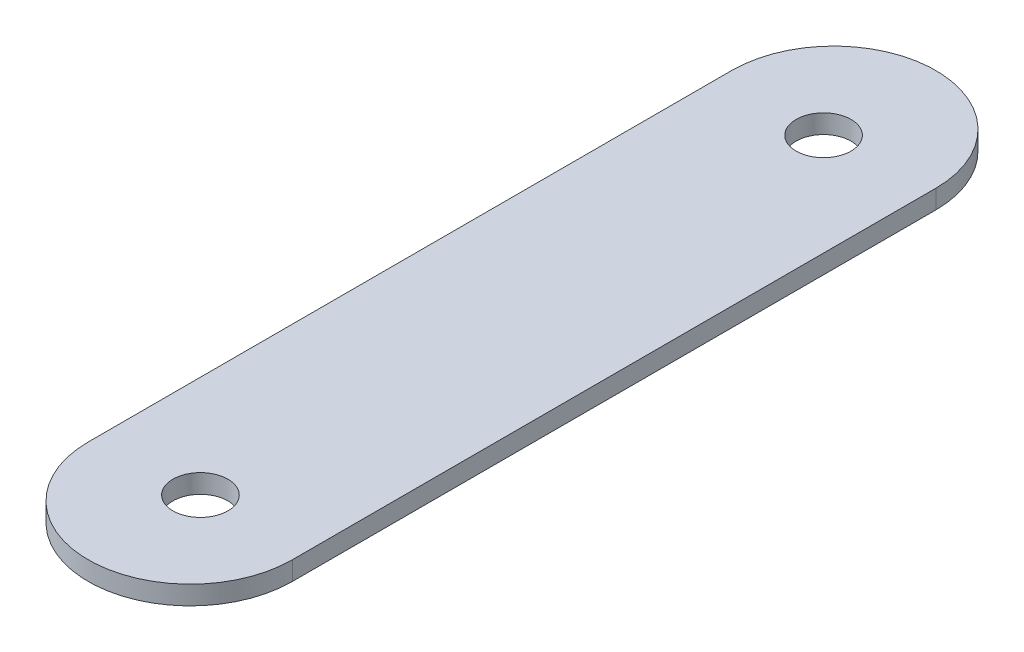
ISO-10303-21;
HEADER;
FILE_DESCRIPTION(('STEP AP214'),'2;1');
FILE_NAME('part.step','',(''),(''),'','','');
FILE_SCHEMA(('AUTOMOTIVE_DESIGN { 1 0 10303 214 1 1 1 1 }'));
ENDSEC;
DATA;
#1=APPLICATION_CONTEXT('core data for automotive mechanical design processes');
#2=APPLICATION_PROTOCOL_DEFINITION('international standard','automotive_design',2000,#1);
#3=PRODUCT_CONTEXT('',#1,'mechanical');
#4=PRODUCT('Part','Part','',(#3));
#5=PRODUCT_RELATED_PRODUCT_CATEGORY('part','',(#4));
#6=PRODUCT_DEFINITION_FORMATION('','',#4);
#7=PRODUCT_DEFINITION_CONTEXT('part definition',#1,'design');
#8=PRODUCT_DEFINITION('design','',#6,#7);
#9=PRODUCT_DEFINITION_SHAPE('','',#8);
#10=(LENGTH_UNIT() NAMED_UNIT(*) SI_UNIT(.MILLI.,.METRE.));
#11=(NAMED_UNIT(*) PLANE_ANGLE_UNIT() SI_UNIT($,.RADIAN.));
#12=(NAMED_UNIT(*) SI_UNIT($,.STERADIAN.) SOLID_ANGLE_UNIT());
#13=UNCERTAINTY_MEASURE_WITH_UNIT(LENGTH_MEASURE(1.E-05),#10,'distance_accuracy_value','');
#14=(GEOMETRIC_REPRESENTATION_CONTEXT(3) GLOBAL_UNCERTAINTY_ASSIGNED_CONTEXT((#13)) GLOBAL_UNIT_ASSIGNED_CONTEXT((#10,
#11,#12)) REPRESENTATION_CONTEXT('',''));
#15=CARTESIAN_POINT('',(0.,0.,0.));
#16=DIRECTION('',(0.,0.,1.));
#17=DIRECTION('',(1.,0.,0.));
#18=AXIS2_PLACEMENT_3D('',#15,#16,#17);
#19=CARTESIAN_POINT('',(0.,1.2,-20.5));
#20=DIRECTION('',(0.,-1.,0.));
#21=DIRECTION('',(0.,0.,-1.));
#22=AXIS2_PLACEMENT_3D('',#19,#20,#21);
#23=CYLINDRICAL_SURFACE('',#22,6.5);
#24=CARTESIAN_POINT('',(0.,0.,-20.5));
#25=DIRECTION('',(0.,-1.,0.));
#26=DIRECTION('',(0.,0.,-1.));
#27=AXIS2_PLACEMENT_3D('',#24,#25,#26);
#28=CIRCLE('',#27,6.5);
#29=CARTESIAN_POINT('',(-6.5,0.,-20.5));
#30=VERTEX_POINT('',#29);
#31=CARTESIAN_POINT('',(6.5,0.,-20.5));
#32=VERTEX_POINT('',#31);
#33=EDGE_CURVE('E104',#30,#32,#28,.T.);
#34=ORIENTED_EDGE('',*,*,#33,.F.);
#35=DIRECTION('',(0.,-1.,0.));
#36=VECTOR('',#35,1.);
#37=CARTESIAN_POINT('',(-6.5,1.2,-20.5));
#38=LINE('',#37,#36);
#39=CARTESIAN_POINT('',(-6.5,1.2,-20.5));
#40=VERTEX_POINT('',#39);
#41=EDGE_CURVE('E11',#40,#30,#38,.T.);
#42=ORIENTED_EDGE('',*,*,#41,.F.);
#43=CARTESIAN_POINT('',(0.,1.2,-20.5));
#44=DIRECTION('',(0.,-1.,0.));
#45=DIRECTION('',(0.,0.,-1.));
#46=AXIS2_PLACEMENT_3D('',#43,#44,#45);
#47=CIRCLE('',#46,6.5);
#48=CARTESIAN_POINT('',(6.5,1.2,-20.5));
#49=VERTEX_POINT('',#48);
#50=EDGE_CURVE('E97',#40,#49,#47,.T.);
#51=ORIENTED_EDGE('',*,*,#50,.T.);
#52=DIRECTION('',(0.,-1.,0.));
#53=VECTOR('',#52,1.);
#54=CARTESIAN_POINT('',(6.5,1.2,-20.5));
#55=LINE('',#54,#53);
#56=EDGE_CURVE('E42',#49,#32,#55,.T.);
#57=ORIENTED_EDGE('',*,*,#56,.T.);
#58=EDGE_LOOP('',(#34,#42,#51,#57));
#59=FACE_BOUND('',#58,.T.);
#60=ADVANCED_FACE('F39',(#59),#23,.T.);
#61=CARTESIAN_POINT('',(-6.5,1.2,20.5));
#62=DIRECTION('',(-1.,0.,0.));
#63=DIRECTION('',(0.,0.,1.));
#64=AXIS2_PLACEMENT_3D('',#61,#62,#63);
#65=PLANE('',#64);
#66=DIRECTION('',(0.,0.,-1.));
#67=VECTOR('',#66,1.);
#68=CARTESIAN_POINT('',(-6.5,0.,20.5));
#69=LINE('',#68,#67);
#70=CARTESIAN_POINT('',(-6.5,0.,20.5));
#71=VERTEX_POINT('',#70);
#72=EDGE_CURVE('E99',#71,#30,#69,.T.);
#73=ORIENTED_EDGE('',*,*,#72,.F.);
#74=DIRECTION('',(0.,-1.,0.));
#75=VECTOR('',#74,1.);
#76=CARTESIAN_POINT('',(-6.5,1.2,20.5));
#77=LINE('',#76,#75);
#78=CARTESIAN_POINT('',(-6.5,1.2,20.5));
#79=VERTEX_POINT('',#78);
#80=EDGE_CURVE('E48',#79,#71,#77,.T.);
#81=ORIENTED_EDGE('',*,*,#80,.F.);
#82=DIRECTION('',(0.,0.,-1.));
#83=VECTOR('',#82,1.);
#84=CARTESIAN_POINT('',(-6.5,1.2,20.5));
#85=LINE('',#84,#83);
#86=EDGE_CURVE('E94',#79,#40,#85,.T.);
#87=ORIENTED_EDGE('',*,*,#86,.T.);
#88=ORIENTED_EDGE('',*,*,#41,.T.);
#89=EDGE_LOOP('',(#73,#81,#87,#88));
#90=FACE_BOUND('',#89,.T.);
#91=ADVANCED_FACE('F115',(#90),#65,.T.);
#92=CARTESIAN_POINT('',(0.,1.2,20.5));
#93=DIRECTION('',(0.,-1.,0.));
#94=DIRECTION('',(0.,0.,-1.));
#95=AXIS2_PLACEMENT_3D('',#92,#93,#94);
#96=CYLINDRICAL_SURFACE('',#95,6.5);
#97=CARTESIAN_POINT('',(0.,0.,20.5));
#98=DIRECTION('',(0.,-1.,0.));
#99=DIRECTION('',(0.,0.,-1.));
#100=AXIS2_PLACEMENT_3D('',#97,#98,#99);
#101=CIRCLE('',#100,6.5);
#102=CARTESIAN_POINT('',(6.5,0.,20.5));
#103=VERTEX_POINT('',#102);
#104=EDGE_CURVE('E89',#103,#71,#101,.T.);
#105=ORIENTED_EDGE('',*,*,#104,.F.);
#106=DIRECTION('',(0.,-1.,0.));
#107=VECTOR('',#106,1.);
#108=CARTESIAN_POINT('',(6.5,1.2,20.5));
#109=LINE('',#108,#107);
#110=CARTESIAN_POINT('',(6.5,1.2,20.5));
#111=VERTEX_POINT('',#110);
#112=EDGE_CURVE('E84',#111,#103,#109,.T.);
#113=ORIENTED_EDGE('',*,*,#112,.F.);
#114=CARTESIAN_POINT('',(0.,1.2,20.5));
#115=DIRECTION('',(0.,-1.,0.));
#116=DIRECTION('',(0.,0.,-1.));
#117=AXIS2_PLACEMENT_3D('',#114,#115,#116);
#118=CIRCLE('',#117,6.5);
#119=EDGE_CURVE('E87',#111,#79,#118,.T.);
#120=ORIENTED_EDGE('',*,*,#119,.T.);
#121=ORIENTED_EDGE('',*,*,#80,.T.);
#122=EDGE_LOOP('',(#105,#113,#120,#121));
#123=FACE_BOUND('',#122,.T.);
#124=ADVANCED_FACE('F86',(#123),#96,.T.);
#125=CARTESIAN_POINT('',(6.5,1.2,-20.5));
#126=DIRECTION('',(1.,0.,0.));
#127=DIRECTION('',(0.,0.,-1.));
#128=AXIS2_PLACEMENT_3D('',#125,#126,#127);
#129=PLANE('',#128);
#130=DIRECTION('',(0.,0.,1.));
#131=VECTOR('',#130,1.);
#132=CARTESIAN_POINT('',(6.5,0.,-20.5));
#133=LINE('',#132,#131);
#134=EDGE_CURVE('E107',#32,#103,#133,.T.);
#135=ORIENTED_EDGE('',*,*,#134,.F.);
#136=ORIENTED_EDGE('',*,*,#56,.F.);
#137=DIRECTION('',(0.,0.,1.));
#138=VECTOR('',#137,1.);
#139=CARTESIAN_POINT('',(6.5,1.2,-20.5));
#140=LINE('',#139,#138);
#141=EDGE_CURVE('E93',#49,#111,#140,.T.);
#142=ORIENTED_EDGE('',*,*,#141,.T.);
#143=ORIENTED_EDGE('',*,*,#112,.T.);
#144=EDGE_LOOP('',(#135,#136,#142,#143));
#145=FACE_BOUND('',#144,.T.);
#146=ADVANCED_FACE('F96',(#145),#129,.T.);
#147=CARTESIAN_POINT('',(0.,1.2,-20.5));
#148=DIRECTION('',(0.,-1.,0.));
#149=DIRECTION('',(0.,0.,-1.));
#150=AXIS2_PLACEMENT_3D('',#147,#148,#149);
#151=PLANE('',#150);
#152=CARTESIAN_POINT('',(0.,1.2,-19.85));
#153=DIRECTION('',(0.,-1.,0.));
#154=DIRECTION('',(0.,0.,1.));
#155=AXIS2_PLACEMENT_3D('',#152,#153,#154);
#156=CIRCLE('',#155,1.75);
#157=CARTESIAN_POINT('',(0.,1.2,-18.1));
#158=VERTEX_POINT('',#157);
#159=EDGE_CURVE('E148',#158,#158,#156,.T.);
#160=ORIENTED_EDGE('',*,*,#159,.T.);
#161=EDGE_LOOP('',(#160));
#162=FACE_BOUND('',#161,.T.);
#163=CARTESIAN_POINT('',(0.,1.2,19.85));
#164=DIRECTION('',(0.,-1.,0.));
#165=DIRECTION('',(0.,0.,1.));
#166=AXIS2_PLACEMENT_3D('',#163,#164,#165);
#167=CIRCLE('',#166,1.75);
#168=CARTESIAN_POINT('',(0.,1.2,21.6));
#169=VERTEX_POINT('',#168);
#170=EDGE_CURVE('E108',#169,#169,#167,.T.);
#171=ORIENTED_EDGE('',*,*,#170,.T.);
#172=EDGE_LOOP('',(#171));
#173=FACE_BOUND('',#172,.T.);
#174=ORIENTED_EDGE('',*,*,#50,.F.);
#175=ORIENTED_EDGE('',*,*,#86,.F.);
#176=ORIENTED_EDGE('',*,*,#119,.F.);
#177=ORIENTED_EDGE('',*,*,#141,.F.);
#178=EDGE_LOOP('',(#174,#175,#176,#177));
#179=FACE_BOUND('',#178,.T.);
#180=ADVANCED_FACE('F92',(#162,#173,#179),#151,.F.);
#181=CARTESIAN_POINT('',(0.,0.,-20.5));
#182=DIRECTION('',(0.,-1.,0.));
#183=DIRECTION('',(0.,0.,-1.));
#184=AXIS2_PLACEMENT_3D('',#181,#182,#183);
#185=PLANE('',#184);
#186=CARTESIAN_POINT('',(0.,0.,-19.85));
#187=DIRECTION('',(0.,-1.,0.));
#188=DIRECTION('',(0.,0.,1.));
#189=AXIS2_PLACEMENT_3D('',#186,#187,#188);
#190=CIRCLE('',#189,1.75);
#191=CARTESIAN_POINT('',(0.,0.,-18.1));
#192=VERTEX_POINT('',#191);
#193=EDGE_CURVE('E151',#192,#192,#190,.T.);
#194=ORIENTED_EDGE('',*,*,#193,.F.);
#195=EDGE_LOOP('',(#194));
#196=FACE_BOUND('',#195,.T.);
#197=CARTESIAN_POINT('',(0.,0.,19.85));
#198=DIRECTION('',(0.,-1.,0.));
#199=DIRECTION('',(0.,0.,1.));
#200=AXIS2_PLACEMENT_3D('',#197,#198,#199);
#201=CIRCLE('',#200,1.75);
#202=CARTESIAN_POINT('',(0.,0.,21.6));
#203=VERTEX_POINT('',#202);
#204=EDGE_CURVE('E153',#203,#203,#201,.T.);
#205=ORIENTED_EDGE('',*,*,#204,.F.);
#206=EDGE_LOOP('',(#205));
#207=FACE_BOUND('',#206,.T.);
#208=ORIENTED_EDGE('',*,*,#33,.T.);
#209=ORIENTED_EDGE('',*,*,#134,.T.);
#210=ORIENTED_EDGE('',*,*,#104,.T.);
#211=ORIENTED_EDGE('',*,*,#72,.T.);
#212=EDGE_LOOP('',(#208,#209,#210,#211));
#213=FACE_BOUND('',#212,.T.);
#214=ADVANCED_FACE('F114',(#196,#207,#213),#185,.T.);
#215=CARTESIAN_POINT('',(0.,1.2,19.85));
#216=DIRECTION('',(0.,-1.,0.));
#217=DIRECTION('',(0.,0.,-1.));
#218=AXIS2_PLACEMENT_3D('',#215,#216,#217);
#219=CYLINDRICAL_SURFACE('',#218,1.75);
#220=ORIENTED_EDGE('',*,*,#170,.F.);
#221=EDGE_LOOP('',(#220));
#222=FACE_BOUND('',#221,.T.);
#223=ORIENTED_EDGE('',*,*,#204,.T.);
#224=EDGE_LOOP('',(#223));
#225=FACE_BOUND('',#224,.T.);
#226=ADVANCED_FACE('F133',(#222,#225),#219,.F.);
#227=CARTESIAN_POINT('',(0.,1.2,-19.85));
#228=DIRECTION('',(0.,-1.,0.));
#229=DIRECTION('',(0.,0.,-1.));
#230=AXIS2_PLACEMENT_3D('',#227,#228,#229);
#231=CYLINDRICAL_SURFACE('',#230,1.75);
#232=ORIENTED_EDGE('',*,*,#159,.F.);
#233=EDGE_LOOP('',(#232));
#234=FACE_BOUND('',#233,.T.);
#235=ORIENTED_EDGE('',*,*,#193,.T.);
#236=EDGE_LOOP('',(#235));
#237=FACE_BOUND('',#236,.T.);
#238=ADVANCED_FACE('F140',(#234,#237),#231,.F.);
#239=CLOSED_SHELL('',(#60,#91,#124,#146,#180,#214,#226,#238));
#240=MANIFOLD_SOLID_BREP('B2',#239);
#241=ADVANCED_BREP_SHAPE_REPRESENTATION('',(#18,#240),#14);
#242=SHAPE_DEFINITION_REPRESENTATION(#9,#241);
ENDSEC;
END-ISO-10303-21;
